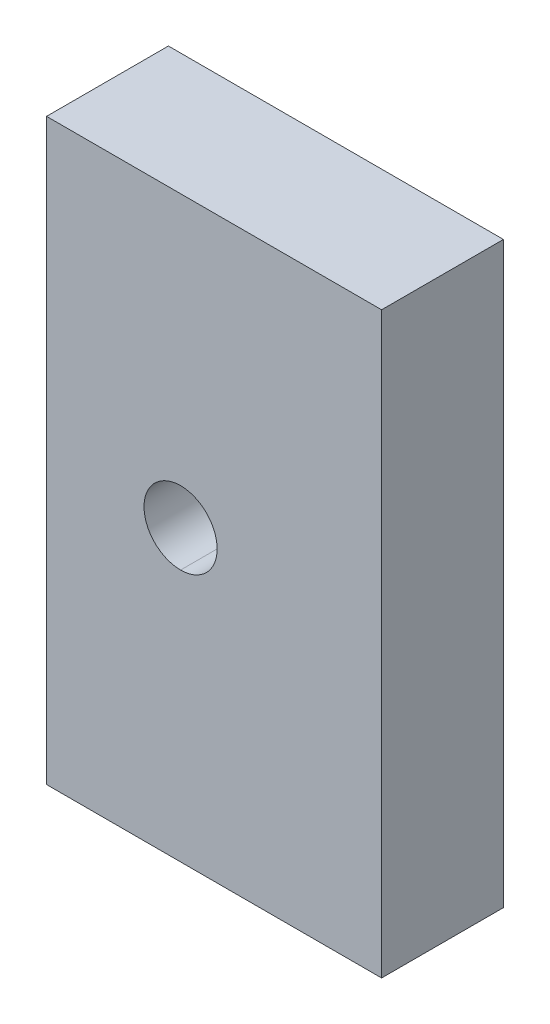
ISO-10303-21;
HEADER;
FILE_DESCRIPTION(('STEP AP214'),'2;1');
FILE_NAME('part.step','',(''),(''),'','','');
FILE_SCHEMA(('AUTOMOTIVE_DESIGN { 1 0 10303 214 1 1 1 1 }'));
ENDSEC;
DATA;
#1=APPLICATION_CONTEXT('core data for automotive mechanical design processes');
#2=APPLICATION_PROTOCOL_DEFINITION('international standard','automotive_design',2000,#1);
#3=PRODUCT_CONTEXT('',#1,'mechanical');
#4=PRODUCT('Part','Part','',(#3));
#5=PRODUCT_RELATED_PRODUCT_CATEGORY('part','',(#4));
#6=PRODUCT_DEFINITION_FORMATION('','',#4);
#7=PRODUCT_DEFINITION_CONTEXT('part definition',#1,'design');
#8=PRODUCT_DEFINITION('design','',#6,#7);
#9=PRODUCT_DEFINITION_SHAPE('','',#8);
#10=(LENGTH_UNIT() NAMED_UNIT(*) SI_UNIT(.MILLI.,.METRE.));
#11=(NAMED_UNIT(*) PLANE_ANGLE_UNIT() SI_UNIT($,.RADIAN.));
#12=(NAMED_UNIT(*) SI_UNIT($,.STERADIAN.) SOLID_ANGLE_UNIT());
#13=UNCERTAINTY_MEASURE_WITH_UNIT(LENGTH_MEASURE(1.E-05),#10,'distance_accuracy_value','');
#14=(GEOMETRIC_REPRESENTATION_CONTEXT(3) GLOBAL_UNCERTAINTY_ASSIGNED_CONTEXT((#13)) GLOBAL_UNIT_ASSIGNED_CONTEXT((#10,
#11,#12)) REPRESENTATION_CONTEXT('',''));
#15=CARTESIAN_POINT('',(0.,0.,0.));
#16=DIRECTION('',(0.,0.,1.));
#17=DIRECTION('',(1.,0.,0.));
#18=AXIS2_PLACEMENT_3D('',#15,#16,#17);
#19=CARTESIAN_POINT('',(-725.,-203.5,40.));
#20=DIRECTION('',(0.,-1.,0.));
#21=DIRECTION('',(0.,0.,1.));
#22=AXIS2_PLACEMENT_3D('',#19,#20,#21);
#23=PLANE('',#22);
#24=DIRECTION('',(-1.,0.,0.));
#25=VECTOR('',#24,1.);
#26=CARTESIAN_POINT('',(-615.,-203.5,40.));
#27=LINE('',#26,#25);
#28=CARTESIAN_POINT('',(-615.,-203.5,40.));
#29=VERTEX_POINT('',#28);
#30=CARTESIAN_POINT('',(-725.,-203.5,40.));
#31=VERTEX_POINT('',#30);
#32=EDGE_CURVE('E122',#29,#31,#27,.T.);
#33=ORIENTED_EDGE('',*,*,#32,.F.);
#34=DIRECTION('',(0.,0.,1.));
#35=VECTOR('',#34,1.);
#36=CARTESIAN_POINT('',(-615.,-203.5,0.));
#37=LINE('',#36,#35);
#38=CARTESIAN_POINT('',(-615.,-203.5,0.));
#39=VERTEX_POINT('',#38);
#40=EDGE_CURVE('E35',#39,#29,#37,.T.);
#41=ORIENTED_EDGE('',*,*,#40,.F.);
#42=DIRECTION('',(1.,0.,0.));
#43=VECTOR('',#42,1.);
#44=CARTESIAN_POINT('',(-725.,-203.5,0.));
#45=LINE('',#44,#43);
#46=CARTESIAN_POINT('',(-725.,-203.5,0.));
#47=VERTEX_POINT('',#46);
#48=EDGE_CURVE('E134',#47,#39,#45,.T.);
#49=ORIENTED_EDGE('',*,*,#48,.F.);
#50=DIRECTION('',(0.,0.,-1.));
#51=VECTOR('',#50,1.);
#52=CARTESIAN_POINT('',(-725.,-203.5,40.));
#53=LINE('',#52,#51);
#54=EDGE_CURVE('E26',#31,#47,#53,.T.);
#55=ORIENTED_EDGE('',*,*,#54,.F.);
#56=EDGE_LOOP('',(#33,#41,#49,#55));
#57=FACE_BOUND('',#56,.T.);
#58=ADVANCED_FACE('F17',(#57),#23,.F.);
#59=CARTESIAN_POINT('',(-725.,-203.5,40.));
#60=DIRECTION('',(-1.,0.,0.));
#61=DIRECTION('',(0.,-1.,0.));
#62=AXIS2_PLACEMENT_3D('',#59,#60,#61);
#63=PLANE('',#62);
#64=DIRECTION('',(0.,-1.,0.));
#65=VECTOR('',#64,1.);
#66=CARTESIAN_POINT('',(-725.,-203.5,0.));
#67=LINE('',#66,#65);
#68=CARTESIAN_POINT('',(-725.,-393.5,0.));
#69=VERTEX_POINT('',#68);
#70=EDGE_CURVE('E11',#47,#69,#67,.T.);
#71=ORIENTED_EDGE('',*,*,#70,.T.);
#72=DIRECTION('',(0.,0.,-1.));
#73=VECTOR('',#72,1.);
#74=CARTESIAN_POINT('',(-725.,-393.5,40.));
#75=LINE('',#74,#73);
#76=CARTESIAN_POINT('',(-725.,-393.5,40.));
#77=VERTEX_POINT('',#76);
#78=EDGE_CURVE('E68',#77,#69,#75,.T.);
#79=ORIENTED_EDGE('',*,*,#78,.F.);
#80=DIRECTION('',(0.,-1.,0.));
#81=VECTOR('',#80,1.);
#82=CARTESIAN_POINT('',(-725.,-203.5,40.));
#83=LINE('',#82,#81);
#84=EDGE_CURVE('E121',#31,#77,#83,.T.);
#85=ORIENTED_EDGE('',*,*,#84,.F.);
#86=ORIENTED_EDGE('',*,*,#54,.T.);
#87=EDGE_LOOP('',(#71,#79,#85,#86));
#88=FACE_BOUND('',#87,.T.);
#89=ADVANCED_FACE('F148',(#88),#63,.T.);
#90=CARTESIAN_POINT('',(-615.,-203.5,40.));
#91=DIRECTION('',(0.,0.,1.));
#92=DIRECTION('',(0.,-1.,0.));
#93=AXIS2_PLACEMENT_3D('',#90,#91,#92);
#94=PLANE('',#93);
#95=ORIENTED_EDGE('',*,*,#84,.T.);
#96=DIRECTION('',(-1.,0.,0.));
#97=VECTOR('',#96,1.);
#98=CARTESIAN_POINT('',(-615.,-393.5,40.));
#99=LINE('',#98,#97);
#100=CARTESIAN_POINT('',(-615.,-393.5,40.));
#101=VERTEX_POINT('',#100);
#102=EDGE_CURVE('E62',#101,#77,#99,.T.);
#103=ORIENTED_EDGE('',*,*,#102,.F.);
#104=DIRECTION('',(0.,-1.,0.));
#105=VECTOR('',#104,1.);
#106=CARTESIAN_POINT('',(-615.,-203.5,40.));
#107=LINE('',#106,#105);
#108=EDGE_CURVE('E116',#29,#101,#107,.T.);
#109=ORIENTED_EDGE('',*,*,#108,.F.);
#110=ORIENTED_EDGE('',*,*,#32,.T.);
#111=EDGE_LOOP('',(#95,#103,#109,#110));
#112=FACE_BOUND('',#111,.T.);
#113=CARTESIAN_POINT('',(-681.,-298.5,40.));
#114=DIRECTION('',(0.,0.,-1.));
#115=DIRECTION('',(0.,-1.,0.));
#116=AXIS2_PLACEMENT_3D('',#113,#114,#115);
#117=CIRCLE('',#116,12.);
#118=CARTESIAN_POINT('',(-681.,-310.5,40.));
#119=VERTEX_POINT('',#118);
#120=CARTESIAN_POINT('',(-681.,-286.5,40.));
#121=VERTEX_POINT('',#120);
#122=EDGE_CURVE('E124',#119,#121,#117,.T.);
#123=ORIENTED_EDGE('',*,*,#122,.T.);
#124=CARTESIAN_POINT('',(-681.,-298.5,40.));
#125=DIRECTION('',(0.,0.,-1.));
#126=DIRECTION('',(0.,1.,0.));
#127=AXIS2_PLACEMENT_3D('',#124,#125,#126);
#128=CIRCLE('',#127,12.);
#129=EDGE_CURVE('E109',#121,#119,#128,.T.);
#130=ORIENTED_EDGE('',*,*,#129,.T.);
#131=EDGE_LOOP('',(#123,#130));
#132=FACE_BOUND('',#131,.T.);
#133=ADVANCED_FACE('F152',(#112,#132),#94,.T.);
#134=CARTESIAN_POINT('',(-615.,-203.5,0.));
#135=DIRECTION('',(1.,0.,0.));
#136=DIRECTION('',(0.,0.,-1.));
#137=AXIS2_PLACEMENT_3D('',#134,#135,#136);
#138=PLANE('',#137);
#139=ORIENTED_EDGE('',*,*,#108,.T.);
#140=DIRECTION('',(0.,0.,1.));
#141=VECTOR('',#140,1.);
#142=CARTESIAN_POINT('',(-615.,-393.5,0.));
#143=LINE('',#142,#141);
#144=CARTESIAN_POINT('',(-615.,-393.5,0.));
#145=VERTEX_POINT('',#144);
#146=EDGE_CURVE('E120',#145,#101,#143,.T.);
#147=ORIENTED_EDGE('',*,*,#146,.F.);
#148=DIRECTION('',(0.,-1.,0.));
#149=VECTOR('',#148,1.);
#150=CARTESIAN_POINT('',(-615.,-203.5,0.));
#151=LINE('',#150,#149);
#152=EDGE_CURVE('E117',#39,#145,#151,.T.);
#153=ORIENTED_EDGE('',*,*,#152,.F.);
#154=ORIENTED_EDGE('',*,*,#40,.T.);
#155=EDGE_LOOP('',(#139,#147,#153,#154));
#156=FACE_BOUND('',#155,.T.);
#157=ADVANCED_FACE('F151',(#156),#138,.T.);
#158=CARTESIAN_POINT('',(-725.,-203.5,0.));
#159=DIRECTION('',(0.,0.,-1.));
#160=DIRECTION('',(1.,0.,0.));
#161=AXIS2_PLACEMENT_3D('',#158,#159,#160);
#162=PLANE('',#161);
#163=ORIENTED_EDGE('',*,*,#152,.T.);
#164=DIRECTION('',(1.,0.,0.));
#165=VECTOR('',#164,1.);
#166=CARTESIAN_POINT('',(-725.,-393.5,0.));
#167=LINE('',#166,#165);
#168=EDGE_CURVE('E133',#69,#145,#167,.T.);
#169=ORIENTED_EDGE('',*,*,#168,.F.);
#170=ORIENTED_EDGE('',*,*,#70,.F.);
#171=ORIENTED_EDGE('',*,*,#48,.T.);
#172=EDGE_LOOP('',(#163,#169,#170,#171));
#173=FACE_BOUND('',#172,.T.);
#174=CARTESIAN_POINT('',(-681.,-298.5,0.));
#175=DIRECTION('',(0.,0.,-1.));
#176=DIRECTION('',(0.,-1.,0.));
#177=AXIS2_PLACEMENT_3D('',#174,#175,#176);
#178=CIRCLE('',#177,19.);
#179=CARTESIAN_POINT('',(-681.,-317.5,0.));
#180=VERTEX_POINT('',#179);
#181=CARTESIAN_POINT('',(-681.,-279.5,0.));
#182=VERTEX_POINT('',#181);
#183=EDGE_CURVE('E105',#180,#182,#178,.T.);
#184=ORIENTED_EDGE('',*,*,#183,.F.);
#185=CARTESIAN_POINT('',(-681.,-298.5,0.));
#186=DIRECTION('',(0.,0.,-1.));
#187=DIRECTION('',(0.,1.,0.));
#188=AXIS2_PLACEMENT_3D('',#185,#186,#187);
#189=CIRCLE('',#188,19.);
#190=EDGE_CURVE('E101',#182,#180,#189,.T.);
#191=ORIENTED_EDGE('',*,*,#190,.F.);
#192=EDGE_LOOP('',(#184,#191));
#193=FACE_BOUND('',#192,.T.);
#194=ADVANCED_FACE('F149',(#173,#193),#162,.T.);
#195=CARTESIAN_POINT('',(-725.,-393.5,40.));
#196=DIRECTION('',(0.,-1.,0.));
#197=DIRECTION('',(0.,0.,1.));
#198=AXIS2_PLACEMENT_3D('',#195,#196,#197);
#199=PLANE('',#198);
#200=ORIENTED_EDGE('',*,*,#168,.T.);
#201=ORIENTED_EDGE('',*,*,#146,.T.);
#202=ORIENTED_EDGE('',*,*,#102,.T.);
#203=ORIENTED_EDGE('',*,*,#78,.T.);
#204=EDGE_LOOP('',(#200,#201,#202,#203));
#205=FACE_BOUND('',#204,.T.);
#206=ADVANCED_FACE('F147',(#205),#199,.T.);
#207=CARTESIAN_POINT('',(-681.,-298.5,6.06217782649002));
#208=DIRECTION('',(0.,0.,-1.));
#209=DIRECTION('',(0.,1.,0.));
#210=AXIS2_PLACEMENT_3D('',#207,#208,#209);
#211=CONICAL_SURFACE('',#210,15.5,0.5235987755982);
#212=DIRECTION('',(0.,-0.500000000000017,-0.866025403784429));
#213=VECTOR('',#212,1.);
#214=CARTESIAN_POINT('',(-681.,-310.5,12.12435565298));
#215=LINE('',#214,#213);
#216=CARTESIAN_POINT('',(-681.,-310.5,12.12435565298));
#217=VERTEX_POINT('',#216);
#218=EDGE_CURVE('E20',#217,#180,#215,.T.);
#219=ORIENTED_EDGE('',*,*,#218,.F.);
#220=CARTESIAN_POINT('',(-681.,-298.5,12.12435565298));
#221=DIRECTION('',(0.,0.,-1.));
#222=DIRECTION('',(0.,1.,0.));
#223=AXIS2_PLACEMENT_3D('',#220,#221,#222);
#224=CIRCLE('',#223,12.);
#225=CARTESIAN_POINT('',(-681.,-286.5,12.12435565298));
#226=VERTEX_POINT('',#225);
#227=EDGE_CURVE('E80',#226,#217,#224,.T.);
#228=ORIENTED_EDGE('',*,*,#227,.F.);
#229=DIRECTION('',(0.,0.500000000000017,-0.866025403784429));
#230=VECTOR('',#229,1.);
#231=CARTESIAN_POINT('',(-681.,-286.5,12.12435565298));
#232=LINE('',#231,#230);
#233=EDGE_CURVE('E85',#226,#182,#232,.T.);
#234=ORIENTED_EDGE('',*,*,#233,.T.);
#235=ORIENTED_EDGE('',*,*,#190,.T.);
#236=EDGE_LOOP('',(#219,#228,#234,#235));
#237=FACE_BOUND('',#236,.T.);
#238=ADVANCED_FACE('F82',(#237),#211,.F.);
#239=CARTESIAN_POINT('',(-681.,-298.5,6.06217782649002));
#240=DIRECTION('',(0.,0.,-1.));
#241=DIRECTION('',(0.,1.,0.));
#242=AXIS2_PLACEMENT_3D('',#239,#240,#241);
#243=CONICAL_SURFACE('',#242,15.5,0.5235987755982);
#244=ORIENTED_EDGE('',*,*,#233,.F.);
#245=CARTESIAN_POINT('',(-681.,-298.5,12.12435565298));
#246=DIRECTION('',(0.,0.,1.));
#247=DIRECTION('',(0.,1.,0.));
#248=AXIS2_PLACEMENT_3D('',#245,#246,#247);
#249=CIRCLE('',#248,12.);
#250=EDGE_CURVE('E96',#226,#217,#249,.T.);
#251=ORIENTED_EDGE('',*,*,#250,.T.);
#252=ORIENTED_EDGE('',*,*,#218,.T.);
#253=ORIENTED_EDGE('',*,*,#183,.T.);
#254=EDGE_LOOP('',(#244,#251,#252,#253));
#255=FACE_BOUND('',#254,.T.);
#256=ADVANCED_FACE('F103',(#255),#243,.F.);
#257=CARTESIAN_POINT('',(-681.,-298.5,42.));
#258=DIRECTION('',(0.,0.,-1.));
#259=DIRECTION('',(0.,1.,0.));
#260=AXIS2_PLACEMENT_3D('',#257,#258,#259);
#261=CYLINDRICAL_SURFACE('',#260,12.);
#262=DIRECTION('',(0.,0.,-1.));
#263=VECTOR('',#262,1.);
#264=CARTESIAN_POINT('',(-681.,-310.5,40.));
#265=LINE('',#264,#263);
#266=EDGE_CURVE('E99',#119,#217,#265,.T.);
#267=ORIENTED_EDGE('',*,*,#266,.T.);
#268=ORIENTED_EDGE('',*,*,#250,.F.);
#269=DIRECTION('',(0.,0.,-1.));
#270=VECTOR('',#269,1.);
#271=CARTESIAN_POINT('',(-681.,-286.5,40.));
#272=LINE('',#271,#270);
#273=EDGE_CURVE('E91',#121,#226,#272,.T.);
#274=ORIENTED_EDGE('',*,*,#273,.F.);
#275=ORIENTED_EDGE('',*,*,#122,.F.);
#276=EDGE_LOOP('',(#267,#268,#274,#275));
#277=FACE_BOUND('',#276,.T.);
#278=ADVANCED_FACE('F97',(#277),#261,.F.);
#279=CARTESIAN_POINT('',(-681.,-298.5,42.));
#280=DIRECTION('',(0.,0.,-1.));
#281=DIRECTION('',(0.,1.,0.));
#282=AXIS2_PLACEMENT_3D('',#279,#280,#281);
#283=CYLINDRICAL_SURFACE('',#282,12.);
#284=ORIENTED_EDGE('',*,*,#273,.T.);
#285=ORIENTED_EDGE('',*,*,#227,.T.);
#286=ORIENTED_EDGE('',*,*,#266,.F.);
#287=ORIENTED_EDGE('',*,*,#129,.F.);
#288=EDGE_LOOP('',(#284,#285,#286,#287));
#289=FACE_BOUND('',#288,.T.);
#290=ADVANCED_FACE('F108',(#289),#283,.F.);
#291=CLOSED_SHELL('',(#58,#89,#133,#157,#194,#206,#238,#256,#278,#290));
#292=MANIFOLD_SOLID_BREP('B1',#291);
#293=ADVANCED_BREP_SHAPE_REPRESENTATION('',(#18,#292),#14);
#294=SHAPE_DEFINITION_REPRESENTATION(#9,#293);
ENDSEC;
END-ISO-10303-21;
